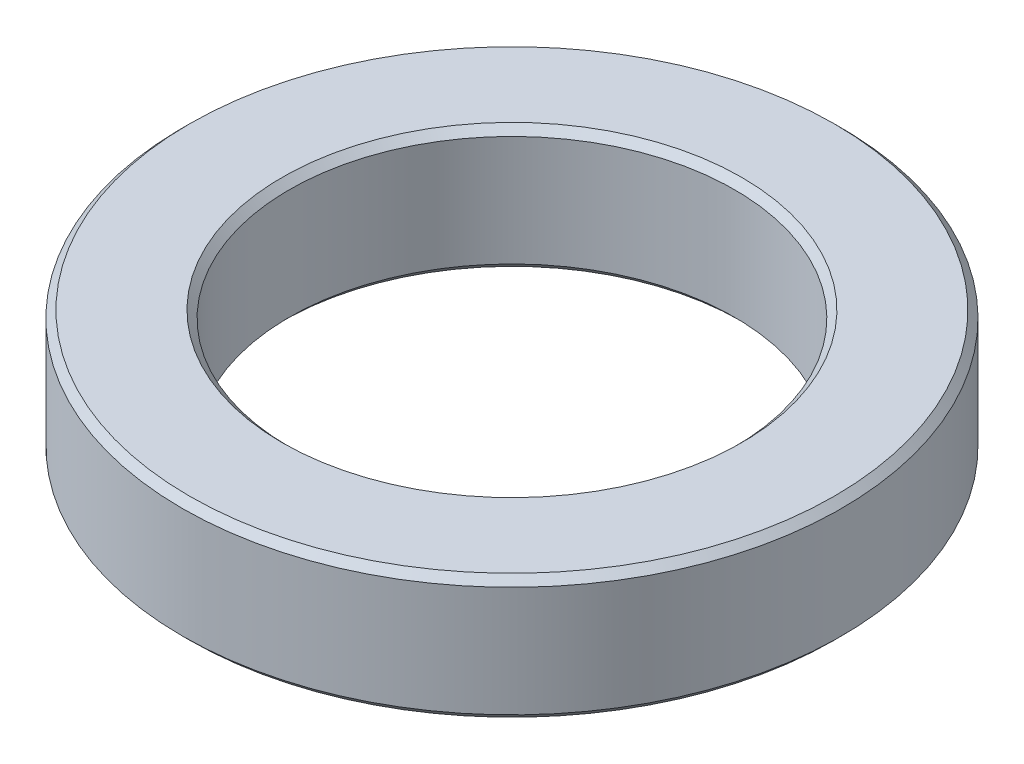
ISO-10303-21;
HEADER;
FILE_DESCRIPTION(('STEP AP214'),'2;1');
FILE_NAME('part.step','',(''),(''),'','','');
FILE_SCHEMA(('AUTOMOTIVE_DESIGN { 1 0 10303 214 1 1 1 1 }'));
ENDSEC;
DATA;
#1=APPLICATION_CONTEXT('core data for automotive mechanical design processes');
#2=APPLICATION_PROTOCOL_DEFINITION('international standard','automotive_design',2000,#1);
#3=PRODUCT_CONTEXT('',#1,'mechanical');
#4=PRODUCT('Part','Part','',(#3));
#5=PRODUCT_RELATED_PRODUCT_CATEGORY('part','',(#4));
#6=PRODUCT_DEFINITION_FORMATION('','',#4);
#7=PRODUCT_DEFINITION_CONTEXT('part definition',#1,'design');
#8=PRODUCT_DEFINITION('design','',#6,#7);
#9=PRODUCT_DEFINITION_SHAPE('','',#8);
#10=(LENGTH_UNIT() NAMED_UNIT(*) SI_UNIT(.MILLI.,.METRE.));
#11=(NAMED_UNIT(*) PLANE_ANGLE_UNIT() SI_UNIT($,.RADIAN.));
#12=(NAMED_UNIT(*) SI_UNIT($,.STERADIAN.) SOLID_ANGLE_UNIT());
#13=UNCERTAINTY_MEASURE_WITH_UNIT(LENGTH_MEASURE(1.E-05),#10,'distance_accuracy_value','');
#14=(GEOMETRIC_REPRESENTATION_CONTEXT(3) GLOBAL_UNCERTAINTY_ASSIGNED_CONTEXT((#13)) GLOBAL_UNIT_ASSIGNED_CONTEXT((#10,
#11,#12)) REPRESENTATION_CONTEXT('',''));
#15=CARTESIAN_POINT('',(0.,0.,0.));
#16=DIRECTION('',(0.,0.,1.));
#17=DIRECTION('',(1.,0.,0.));
#18=AXIS2_PLACEMENT_3D('',#15,#16,#17);
#19=CARTESIAN_POINT('',(0.,7.,0.));
#20=DIRECTION('',(0.,1.,0.));
#21=DIRECTION('',(0.,0.,1.));
#22=AXIS2_PLACEMENT_3D('',#19,#20,#21);
#23=PLANE('',#22);
#24=CARTESIAN_POINT('',(0.,7.,0.));
#25=DIRECTION('',(0.,1.,0.));
#26=DIRECTION('',(0.,0.,1.));
#27=AXIS2_PLACEMENT_3D('',#24,#25,#26);
#28=CIRCLE('',#27,12.9);
#29=CARTESIAN_POINT('',(0.,7.,12.9));
#30=VERTEX_POINT('',#29);
#31=EDGE_CURVE('E61',#30,#30,#28,.F.);
#32=ORIENTED_EDGE('',*,*,#31,.T.);
#33=EDGE_LOOP('',(#32));
#34=FACE_BOUND('',#33,.T.);
#35=CARTESIAN_POINT('',(0.,7.,0.));
#36=DIRECTION('',(0.,1.,0.));
#37=DIRECTION('',(0.,0.,1.));
#38=AXIS2_PLACEMENT_3D('',#35,#36,#37);
#39=CIRCLE('',#38,18.1);
#40=CARTESIAN_POINT('',(0.,7.,18.1));
#41=VERTEX_POINT('',#40);
#42=EDGE_CURVE('E66',#41,#41,#39,.T.);
#43=ORIENTED_EDGE('',*,*,#42,.T.);
#44=EDGE_LOOP('',(#43));
#45=FACE_BOUND('',#44,.T.);
#46=ADVANCED_FACE('F47',(#34,#45),#23,.T.);
#47=CARTESIAN_POINT('',(0.,0.,0.));
#48=DIRECTION('',(0.,1.,0.));
#49=DIRECTION('',(0.,0.,1.));
#50=AXIS2_PLACEMENT_3D('',#47,#48,#49);
#51=PLANE('',#50);
#52=CARTESIAN_POINT('',(0.,0.,0.));
#53=DIRECTION('',(0.,1.,0.));
#54=DIRECTION('',(0.,0.,1.));
#55=AXIS2_PLACEMENT_3D('',#52,#53,#54);
#56=CIRCLE('',#55,12.9);
#57=CARTESIAN_POINT('',(0.,0.,12.9));
#58=VERTEX_POINT('',#57);
#59=EDGE_CURVE('E80',#58,#58,#56,.T.);
#60=ORIENTED_EDGE('',*,*,#59,.T.);
#61=EDGE_LOOP('',(#60));
#62=FACE_BOUND('',#61,.T.);
#63=CARTESIAN_POINT('',(0.,0.,0.));
#64=DIRECTION('',(0.,1.,0.));
#65=DIRECTION('',(0.,0.,1.));
#66=AXIS2_PLACEMENT_3D('',#63,#64,#65);
#67=CIRCLE('',#66,18.1);
#68=CARTESIAN_POINT('',(0.,0.,18.1));
#69=VERTEX_POINT('',#68);
#70=EDGE_CURVE('E84',#69,#69,#67,.F.);
#71=ORIENTED_EDGE('',*,*,#70,.T.);
#72=EDGE_LOOP('',(#71));
#73=FACE_BOUND('',#72,.T.);
#74=ADVANCED_FACE('F89',(#62,#73),#51,.F.);
#75=CARTESIAN_POINT('',(0.,7.,0.));
#76=DIRECTION('',(0.,-1.,0.));
#77=DIRECTION('',(0.,0.,-1.));
#78=AXIS2_PLACEMENT_3D('',#75,#76,#77);
#79=CYLINDRICAL_SURFACE('',#78,18.5);
#80=CARTESIAN_POINT('',(0.,0.400000000000001,0.));
#81=DIRECTION('',(0.,1.,0.));
#82=DIRECTION('',(0.,0.,1.));
#83=AXIS2_PLACEMENT_3D('',#80,#81,#82);
#84=CIRCLE('',#83,18.5);
#85=CARTESIAN_POINT('',(0.,0.400000000000001,18.5));
#86=VERTEX_POINT('',#85);
#87=EDGE_CURVE('E10',#86,#86,#84,.T.);
#88=ORIENTED_EDGE('',*,*,#87,.T.);
#89=EDGE_LOOP('',(#88));
#90=FACE_BOUND('',#89,.T.);
#91=CARTESIAN_POINT('',(0.,6.60000000000001,0.));
#92=DIRECTION('',(0.,1.,0.));
#93=DIRECTION('',(0.,0.,1.));
#94=AXIS2_PLACEMENT_3D('',#91,#92,#93);
#95=CIRCLE('',#94,18.5);
#96=CARTESIAN_POINT('',(0.,6.60000000000001,18.5));
#97=VERTEX_POINT('',#96);
#98=EDGE_CURVE('E56',#97,#97,#95,.F.);
#99=ORIENTED_EDGE('',*,*,#98,.T.);
#100=EDGE_LOOP('',(#99));
#101=FACE_BOUND('',#100,.T.);
#102=ADVANCED_FACE('F110',(#90,#101),#79,.T.);
#103=CARTESIAN_POINT('',(0.,7.,0.));
#104=DIRECTION('',(0.,-1.,0.));
#105=DIRECTION('',(0.,0.,-1.));
#106=AXIS2_PLACEMENT_3D('',#103,#104,#105);
#107=CYLINDRICAL_SURFACE('',#106,12.5);
#108=CARTESIAN_POINT('',(0.,0.400000000000006,0.));
#109=DIRECTION('',(0.,1.,0.));
#110=DIRECTION('',(0.,0.,1.));
#111=AXIS2_PLACEMENT_3D('',#108,#109,#110);
#112=CIRCLE('',#111,12.5);
#113=CARTESIAN_POINT('',(0.,0.400000000000006,12.5));
#114=VERTEX_POINT('',#113);
#115=EDGE_CURVE('E72',#114,#114,#112,.F.);
#116=ORIENTED_EDGE('',*,*,#115,.T.);
#117=EDGE_LOOP('',(#116));
#118=FACE_BOUND('',#117,.T.);
#119=CARTESIAN_POINT('',(0.,6.59999999999998,0.));
#120=DIRECTION('',(0.,1.,0.));
#121=DIRECTION('',(0.,0.,1.));
#122=AXIS2_PLACEMENT_3D('',#119,#120,#121);
#123=CIRCLE('',#122,12.5);
#124=CARTESIAN_POINT('',(0.,6.59999999999998,12.5));
#125=VERTEX_POINT('',#124);
#126=EDGE_CURVE('E76',#125,#125,#123,.T.);
#127=ORIENTED_EDGE('',*,*,#126,.T.);
#128=EDGE_LOOP('',(#127));
#129=FACE_BOUND('',#128,.T.);
#130=ADVANCED_FACE('F115',(#118,#129),#107,.F.);
#131=CARTESIAN_POINT('',(0.,0.,0.));
#132=DIRECTION('',(0.,-1.,0.));
#133=DIRECTION('',(0.,0.,-1.));
#134=AXIS2_PLACEMENT_3D('',#131,#132,#133);
#135=CONICAL_SURFACE('',#134,12.9,0.785398163397444);
#136=ORIENTED_EDGE('',*,*,#115,.F.);
#137=EDGE_LOOP('',(#136));
#138=FACE_BOUND('',#137,.T.);
#139=ORIENTED_EDGE('',*,*,#59,.F.);
#140=EDGE_LOOP('',(#139));
#141=FACE_BOUND('',#140,.T.);
#142=ADVANCED_FACE('F100',(#138,#141),#135,.F.);
#143=CARTESIAN_POINT('',(0.,6.59999999999998,0.));
#144=DIRECTION('',(0.,1.,0.));
#145=DIRECTION('',(0.,0.,1.));
#146=AXIS2_PLACEMENT_3D('',#143,#144,#145);
#147=CONICAL_SURFACE('',#146,12.5,0.785398163397453);
#148=CARTESIAN_POINT('',(0.,7.,12.9));
#149=CARTESIAN_POINT('',(0.,6.99583333333333,12.8958333333334));
#150=CARTESIAN_POINT('',(0.,6.99166666666667,12.8916666666667));
#151=CARTESIAN_POINT('',(0.,6.98333333333333,12.8833333333334));
#152=CARTESIAN_POINT('',(0.,6.97916666666667,12.8791666666667));
#153=CARTESIAN_POINT('',(0.,6.97083333333333,12.8708333333334));
#154=CARTESIAN_POINT('',(0.,6.96666666666667,12.8666666666667));
#155=CARTESIAN_POINT('',(0.,6.95833333333333,12.8583333333334));
#156=CARTESIAN_POINT('',(0.,6.95416666666666,12.8541666666667));
#157=CARTESIAN_POINT('',(0.,6.94583333333333,12.8458333333334));
#158=CARTESIAN_POINT('',(0.,6.94166666666666,12.8416666666667));
#159=CARTESIAN_POINT('',(0.,6.93333333333333,12.8333333333334));
#160=CARTESIAN_POINT('',(0.,6.92916666666666,12.8291666666667));
#161=CARTESIAN_POINT('',(0.,6.92083333333333,12.8208333333334));
#162=CARTESIAN_POINT('',(0.,6.91666666666666,12.8166666666667));
#163=CARTESIAN_POINT('',(0.,6.90833333333333,12.8083333333334));
#164=CARTESIAN_POINT('',(0.,6.90416666666666,12.8041666666667));
#165=CARTESIAN_POINT('',(0.,6.89583333333333,12.7958333333334));
#166=CARTESIAN_POINT('',(0.,6.89166666666666,12.7916666666667));
#167=CARTESIAN_POINT('',(0.,6.88333333333333,12.7833333333334));
#168=CARTESIAN_POINT('',(0.,6.87916666666666,12.7791666666667));
#169=CARTESIAN_POINT('',(0.,6.87083333333333,12.7708333333333));
#170=CARTESIAN_POINT('',(0.,6.86666666666666,12.7666666666667));
#171=CARTESIAN_POINT('',(0.,6.85833333333333,12.7583333333333));
#172=CARTESIAN_POINT('',(0.,6.85416666666666,12.7541666666667));
#173=CARTESIAN_POINT('',(0.,6.84583333333333,12.7458333333333));
#174=CARTESIAN_POINT('',(0.,6.84166666666666,12.7416666666667));
#175=CARTESIAN_POINT('',(0.,6.83333333333332,12.7333333333333));
#176=CARTESIAN_POINT('',(0.,6.82916666666666,12.7291666666667));
#177=CARTESIAN_POINT('',(0.,6.82083333333332,12.7208333333333));
#178=CARTESIAN_POINT('',(0.,6.81666666666666,12.7166666666667));
#179=CARTESIAN_POINT('',(0.,6.80833333333332,12.7083333333333));
#180=CARTESIAN_POINT('',(0.,6.80416666666666,12.7041666666667));
#181=CARTESIAN_POINT('',(0.,6.79583333333332,12.6958333333333));
#182=CARTESIAN_POINT('',(0.,6.79166666666666,12.6916666666667));
#183=CARTESIAN_POINT('',(0.,6.78333333333332,12.6833333333333));
#184=CARTESIAN_POINT('',(0.,6.77916666666666,12.6791666666667));
#185=CARTESIAN_POINT('',(0.,6.77083333333332,12.6708333333333));
#186=CARTESIAN_POINT('',(0.,6.76666666666666,12.6666666666667));
#187=CARTESIAN_POINT('',(0.,6.75833333333332,12.6583333333333));
#188=CARTESIAN_POINT('',(0.,6.75416666666665,12.6541666666667));
#189=CARTESIAN_POINT('',(0.,6.74583333333332,12.6458333333333));
#190=CARTESIAN_POINT('',(0.,6.74166666666665,12.6416666666667));
#191=CARTESIAN_POINT('',(0.,6.73333333333332,12.6333333333333));
#192=CARTESIAN_POINT('',(0.,6.72916666666665,12.6291666666667));
#193=CARTESIAN_POINT('',(0.,6.72083333333332,12.6208333333333));
#194=CARTESIAN_POINT('',(0.,6.71666666666665,12.6166666666667));
#195=CARTESIAN_POINT('',(0.,6.70833333333332,12.6083333333333));
#196=CARTESIAN_POINT('',(0.,6.70416666666665,12.6041666666667));
#197=CARTESIAN_POINT('',(0.,6.69583333333332,12.5958333333333));
#198=CARTESIAN_POINT('',(0.,6.69166666666665,12.5916666666667));
#199=CARTESIAN_POINT('',(0.,6.68333333333332,12.5833333333333));
#200=CARTESIAN_POINT('',(0.,6.67916666666665,12.5791666666667));
#201=CARTESIAN_POINT('',(0.,6.67083333333332,12.5708333333333));
#202=CARTESIAN_POINT('',(0.,6.66666666666665,12.5666666666667));
#203=CARTESIAN_POINT('',(0.,6.65833333333332,12.5583333333333));
#204=CARTESIAN_POINT('',(0.,6.65416666666665,12.5541666666667));
#205=CARTESIAN_POINT('',(0.,6.64583333333332,12.5458333333333));
#206=CARTESIAN_POINT('',(0.,6.64166666666665,12.5416666666667));
#207=CARTESIAN_POINT('',(0.,6.63333333333331,12.5333333333333));
#208=CARTESIAN_POINT('',(0.,6.62916666666665,12.5291666666667));
#209=CARTESIAN_POINT('',(0.,6.62083333333331,12.5208333333333));
#210=CARTESIAN_POINT('',(0.,6.61666666666665,12.5166666666667));
#211=CARTESIAN_POINT('',(0.,6.60833333333331,12.5083333333333));
#212=CARTESIAN_POINT('',(0.,6.60416666666665,12.5041666666667));
#213=CARTESIAN_POINT('',(0.,6.59999999999998,12.5));
#214=B_SPLINE_CURVE_WITH_KNOTS('',3,(#148,#149,#150,#151,#152,#153,#154,#155,#156,#157,#158,
#159,#160,#161,#162,#163,#164,#165,#166,#167,#168,#169,#170,#171,#172,#173,#174,#175,#176,#177,
#178,#179,#180,#181,#182,#183,#184,#185,#186,#187,#188,#189,#190,#191,#192,#193,#194,#195,#196,
#197,#198,#199,#200,#201,#202,#203,#204,#205,#206,#207,#208,#209,#210,#211,#212,#213),
.UNSPECIFIED.,.F.,.F.,(4,2,2,2,2,2,2,2,2,2,2,2,2,2,2,2,2,2,2,2,2,2,2,2,2,2,2,2,2,2,2,2,4),(0.,
0.0176776695296648,0.0353553390593302,0.0530330085889944,0.0707106781186592,0.0883883476483234,
0.106066017177988,0.123743686707654,0.141421356237318,0.159099025766982,0.176776695296647,
0.194454364826312,0.212132034355976,0.229809703885641,0.247487373415306,0.265165042944971,
0.282842712474635,0.3005203820043,0.318198051533964,0.335875721063628,0.353553390593294,
0.371231060122959,0.388908729652623,0.406586399182288,0.424264068711952,0.441941738241617,
0.459619407771282,0.477297077300946,0.49497474683061,0.512652416360276,0.530330085889941,
0.548007755419605,0.565685424949269),.UNSPECIFIED.);
#215=EDGE_CURVE('BSEAM94',#30,#125,#214,.T.);
#216=ORIENTED_EDGE('',*,*,#31,.F.);
#217=ORIENTED_EDGE('',*,*,#126,.F.);
#218=ORIENTED_EDGE('',*,*,#215,.T.);
#219=ORIENTED_EDGE('',*,*,#215,.F.);
#220=EDGE_LOOP('',(#216,#218,#217,#219));
#221=FACE_BOUND('',#220,.T.);
#222=ADVANCED_FACE('F94',(#221),#147,.F.);
#223=CARTESIAN_POINT('',(0.,0.400000000000001,0.));
#224=DIRECTION('',(0.,1.,0.));
#225=DIRECTION('',(0.,0.,1.));
#226=AXIS2_PLACEMENT_3D('',#223,#224,#225);
#227=CONICAL_SURFACE('',#226,18.5,0.785398163397453);
#228=ORIENTED_EDGE('',*,*,#70,.F.);
#229=EDGE_LOOP('',(#228));
#230=FACE_BOUND('',#229,.T.);
#231=ORIENTED_EDGE('',*,*,#87,.F.);
#232=EDGE_LOOP('',(#231));
#233=FACE_BOUND('',#232,.T.);
#234=ADVANCED_FACE('F91',(#230,#233),#227,.T.);
#235=CARTESIAN_POINT('',(0.,7.,0.));
#236=DIRECTION('',(0.,-1.,0.));
#237=DIRECTION('',(0.,0.,-1.));
#238=AXIS2_PLACEMENT_3D('',#235,#236,#237);
#239=CONICAL_SURFACE('',#238,18.1,0.785398163397448);
#240=ORIENTED_EDGE('',*,*,#98,.F.);
#241=EDGE_LOOP('',(#240));
#242=FACE_BOUND('',#241,.T.);
#243=ORIENTED_EDGE('',*,*,#42,.F.);
#244=EDGE_LOOP('',(#243));
#245=FACE_BOUND('',#244,.T.);
#246=ADVANCED_FACE('F50',(#242,#245),#239,.T.);
#247=CLOSED_SHELL('',(#46,#74,#102,#130,#142,#222,#234,#246));
#248=MANIFOLD_SOLID_BREP('B2',#247);
#249=ADVANCED_BREP_SHAPE_REPRESENTATION('',(#18,#248),#14);
#250=SHAPE_DEFINITION_REPRESENTATION(#9,#249);
ENDSEC;
END-ISO-10303-21;
